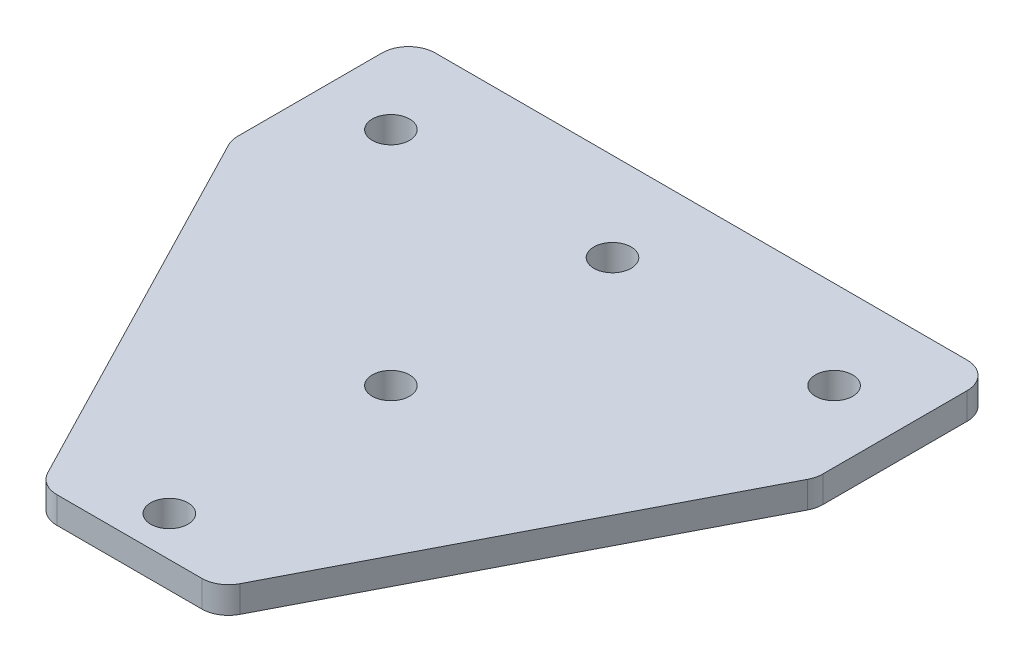
ISO-10303-21;
HEADER;
FILE_DESCRIPTION(('STEP AP214'),'2;1');
FILE_NAME('part.step','',(''),(''),'','','');
FILE_SCHEMA(('AUTOMOTIVE_DESIGN { 1 0 10303 214 1 1 1 1 }'));
ENDSEC;
DATA;
#1=APPLICATION_CONTEXT('core data for automotive mechanical design processes');
#2=APPLICATION_PROTOCOL_DEFINITION('international standard','automotive_design',2000,#1);
#3=PRODUCT_CONTEXT('',#1,'mechanical');
#4=PRODUCT('Part','Part','',(#3));
#5=PRODUCT_RELATED_PRODUCT_CATEGORY('part','',(#4));
#6=PRODUCT_DEFINITION_FORMATION('','',#4);
#7=PRODUCT_DEFINITION_CONTEXT('part definition',#1,'design');
#8=PRODUCT_DEFINITION('design','',#6,#7);
#9=PRODUCT_DEFINITION_SHAPE('','',#8);
#10=(LENGTH_UNIT() NAMED_UNIT(*) SI_UNIT(.MILLI.,.METRE.));
#11=(NAMED_UNIT(*) PLANE_ANGLE_UNIT() SI_UNIT($,.RADIAN.));
#12=(NAMED_UNIT(*) SI_UNIT($,.STERADIAN.) SOLID_ANGLE_UNIT());
#13=UNCERTAINTY_MEASURE_WITH_UNIT(LENGTH_MEASURE(1.E-05),#10,'distance_accuracy_value','');
#14=(GEOMETRIC_REPRESENTATION_CONTEXT(3) GLOBAL_UNCERTAINTY_ASSIGNED_CONTEXT((#13)) GLOBAL_UNIT_ASSIGNED_CONTEXT((#10,
#11,#12)) REPRESENTATION_CONTEXT('',''));
#15=CARTESIAN_POINT('',(0.,0.,0.));
#16=DIRECTION('',(0.,0.,1.));
#17=DIRECTION('',(1.,0.,0.));
#18=AXIS2_PLACEMENT_3D('',#15,#16,#17);
#19=CARTESIAN_POINT('',(30.121849158115,3.,15.5685961940819));
#20=DIRECTION('',(0.888358054995092,0.,0.459151354267126));
#21=DIRECTION('',(0.459151354267126,0.,-0.888358054995093));
#22=AXIS2_PLACEMENT_3D('',#19,#20,#21);
#23=PLANE('',#22);
#24=DIRECTION('',(-0.459151354267126,0.,0.888358054995093));
#25=VECTOR('',#24,1.);
#26=CARTESIAN_POINT('',(30.121849158115,3.,15.5685961940819));
#27=LINE('',#26,#25);
#28=CARTESIAN_POINT('',(32.6650741649853,3.,10.6480086807894));
#29=VERTEX_POINT('',#28);
#30=CARTESIAN_POINT('',(10.8386192484398,3.,52.8774540628014));
#31=VERTEX_POINT('',#30);
#32=EDGE_CURVE('E216',#29,#31,#27,.T.);
#33=ORIENTED_EDGE('',*,*,#32,.T.);
#34=DIRECTION('',(0.,-1.,0.));
#35=VECTOR('',#34,1.);
#36=CARTESIAN_POINT('',(10.8386192484398,0.,52.8774540628014));
#37=LINE('',#36,#35);
#38=CARTESIAN_POINT('',(10.8386192484398,0.,52.8774540628014));
#39=VERTEX_POINT('',#38);
#40=EDGE_CURVE('E151',#31,#39,#37,.T.);
#41=ORIENTED_EDGE('',*,*,#40,.T.);
#42=DIRECTION('',(-0.459151354267126,0.,0.888358054995093));
#43=VECTOR('',#42,1.);
#44=CARTESIAN_POINT('',(30.121849158115,0.,15.5685961940819));
#45=LINE('',#44,#43);
#46=CARTESIAN_POINT('',(32.6650741649853,0.,10.6480086807894));
#47=VERTEX_POINT('',#46);
#48=EDGE_CURVE('E136',#47,#39,#45,.T.);
#49=ORIENTED_EDGE('',*,*,#48,.F.);
#50=DIRECTION('',(0.,-1.,0.));
#51=VECTOR('',#50,1.);
#52=CARTESIAN_POINT('',(32.6650741649853,3.,10.6480086807894));
#53=LINE('',#52,#51);
#54=EDGE_CURVE('E148',#47,#29,#53,.F.);
#55=ORIENTED_EDGE('',*,*,#54,.T.);
#56=EDGE_LOOP('',(#33,#41,#49,#55));
#57=FACE_BOUND('',#56,.T.);
#58=ADVANCED_FACE('F41',(#57),#23,.T.);
#59=CARTESIAN_POINT('',(33.,3.,0.));
#60=DIRECTION('',(-1.,0.,0.));
#61=DIRECTION('',(0.,0.,1.));
#62=AXIS2_PLACEMENT_3D('',#59,#60,#61);
#63=PLANE('',#62);
#64=DIRECTION('',(0.,0.,-1.));
#65=VECTOR('',#64,1.);
#66=CARTESIAN_POINT('',(33.,3.,0.));
#67=LINE('',#66,#65);
#68=CARTESIAN_POINT('',(33.,3.,9.27055461798798));
#69=VERTEX_POINT('',#68);
#70=CARTESIAN_POINT('',(33.,3.,-7.));
#71=VERTEX_POINT('',#70);
#72=EDGE_CURVE('E207',#69,#71,#67,.T.);
#73=ORIENTED_EDGE('',*,*,#72,.F.);
#74=DIRECTION('',(0.,-1.,0.));
#75=VECTOR('',#74,1.);
#76=CARTESIAN_POINT('',(33.,0.,9.27055461798798));
#77=LINE('',#76,#75);
#78=CARTESIAN_POINT('',(33.,0.,9.27055461798798));
#79=VERTEX_POINT('',#78);
#80=EDGE_CURVE('E11',#69,#79,#77,.T.);
#81=ORIENTED_EDGE('',*,*,#80,.T.);
#82=DIRECTION('',(0.,0.,-1.));
#83=VECTOR('',#82,1.);
#84=CARTESIAN_POINT('',(33.,0.,0.));
#85=LINE('',#84,#83);
#86=CARTESIAN_POINT('',(33.,0.,-7.));
#87=VERTEX_POINT('',#86);
#88=EDGE_CURVE('E138',#79,#87,#85,.T.);
#89=ORIENTED_EDGE('',*,*,#88,.T.);
#90=DIRECTION('',(0.,-1.,0.));
#91=VECTOR('',#90,1.);
#92=CARTESIAN_POINT('',(33.,3.,-7.));
#93=LINE('',#92,#91);
#94=EDGE_CURVE('E49',#87,#71,#93,.F.);
#95=ORIENTED_EDGE('',*,*,#94,.T.);
#96=EDGE_LOOP('',(#73,#81,#89,#95));
#97=FACE_BOUND('',#96,.T.);
#98=ADVANCED_FACE('F206',(#97),#63,.F.);
#99=CARTESIAN_POINT('',(0.,3.,-10.));
#100=DIRECTION('',(0.,0.,1.));
#101=DIRECTION('',(1.,0.,0.));
#102=AXIS2_PLACEMENT_3D('',#99,#100,#101);
#103=PLANE('',#102);
#104=DIRECTION('',(-1.,0.,0.));
#105=VECTOR('',#104,1.);
#106=CARTESIAN_POINT('',(0.,0.,-10.));
#107=LINE('',#106,#105);
#108=CARTESIAN_POINT('',(30.,0.,-10.));
#109=VERTEX_POINT('',#108);
#110=CARTESIAN_POINT('',(-30.,0.,-10.));
#111=VERTEX_POINT('',#110);
#112=EDGE_CURVE('E223',#109,#111,#107,.T.);
#113=ORIENTED_EDGE('',*,*,#112,.T.);
#114=DIRECTION('',(0.,-1.,0.));
#115=VECTOR('',#114,1.);
#116=CARTESIAN_POINT('',(-30.,3.,-10.));
#117=LINE('',#116,#115);
#118=CARTESIAN_POINT('',(-30.,3.,-10.));
#119=VERTEX_POINT('',#118);
#120=EDGE_CURVE('E201',#111,#119,#117,.F.);
#121=ORIENTED_EDGE('',*,*,#120,.T.);
#122=DIRECTION('',(-1.,0.,0.));
#123=VECTOR('',#122,1.);
#124=CARTESIAN_POINT('',(0.,3.,-10.));
#125=LINE('',#124,#123);
#126=CARTESIAN_POINT('',(30.,3.,-10.));
#127=VERTEX_POINT('',#126);
#128=EDGE_CURVE('E215',#127,#119,#125,.T.);
#129=ORIENTED_EDGE('',*,*,#128,.F.);
#130=DIRECTION('',(0.,-1.,0.));
#131=VECTOR('',#130,1.);
#132=CARTESIAN_POINT('',(30.,3.,-10.));
#133=LINE('',#132,#131);
#134=EDGE_CURVE('E198',#127,#109,#133,.T.);
#135=ORIENTED_EDGE('',*,*,#134,.T.);
#136=EDGE_LOOP('',(#113,#121,#129,#135));
#137=FACE_BOUND('',#136,.T.);
#138=ADVANCED_FACE('F222',(#137),#103,.F.);
#139=CARTESIAN_POINT('',(-33.,3.,0.));
#140=DIRECTION('',(1.,0.,0.));
#141=DIRECTION('',(0.,0.,-1.));
#142=AXIS2_PLACEMENT_3D('',#139,#140,#141);
#143=PLANE('',#142);
#144=DIRECTION('',(0.,0.,1.));
#145=VECTOR('',#144,1.);
#146=CARTESIAN_POINT('',(-33.,0.,0.));
#147=LINE('',#146,#145);
#148=CARTESIAN_POINT('',(-33.,0.,-7.));
#149=VERTEX_POINT('',#148);
#150=CARTESIAN_POINT('',(-33.,0.,9.27055461798796));
#151=VERTEX_POINT('',#150);
#152=EDGE_CURVE('E226',#149,#151,#147,.T.);
#153=ORIENTED_EDGE('',*,*,#152,.T.);
#154=DIRECTION('',(0.,-1.,0.));
#155=VECTOR('',#154,1.);
#156=CARTESIAN_POINT('',(-33.,3.,9.27055461798796));
#157=LINE('',#156,#155);
#158=CARTESIAN_POINT('',(-33.,3.,9.27055461798796));
#159=VERTEX_POINT('',#158);
#160=EDGE_CURVE('E196',#151,#159,#157,.F.);
#161=ORIENTED_EDGE('',*,*,#160,.T.);
#162=DIRECTION('',(0.,0.,1.));
#163=VECTOR('',#162,1.);
#164=CARTESIAN_POINT('',(-33.,3.,0.));
#165=LINE('',#164,#163);
#166=CARTESIAN_POINT('',(-33.,3.,-7.));
#167=VERTEX_POINT('',#166);
#168=EDGE_CURVE('E255',#167,#159,#165,.T.);
#169=ORIENTED_EDGE('',*,*,#168,.F.);
#170=DIRECTION('',(0.,-1.,0.));
#171=VECTOR('',#170,1.);
#172=CARTESIAN_POINT('',(-33.,3.,-7.));
#173=LINE('',#172,#171);
#174=EDGE_CURVE('E193',#167,#149,#173,.T.);
#175=ORIENTED_EDGE('',*,*,#174,.T.);
#176=EDGE_LOOP('',(#153,#161,#169,#175));
#177=FACE_BOUND('',#176,.T.);
#178=ADVANCED_FACE('F368',(#177),#143,.F.);
#179=CARTESIAN_POINT('',(-30.121849158115,3.,15.5685961940819));
#180=DIRECTION('',(0.888358054995092,0.,-0.459151354267127));
#181=DIRECTION('',(-0.459151354267127,0.,-0.888358054995092));
#182=AXIS2_PLACEMENT_3D('',#179,#180,#181);
#183=PLANE('',#182);
#184=DIRECTION('',(0.459151354267127,0.,0.888358054995093));
#185=VECTOR('',#184,1.);
#186=CARTESIAN_POINT('',(-30.121849158115,0.,15.5685961940819));
#187=LINE('',#186,#185);
#188=CARTESIAN_POINT('',(-32.6650741649853,0.,10.6480086807893));
#189=VERTEX_POINT('',#188);
#190=CARTESIAN_POINT('',(-10.8386192484397,0.,52.8774540628014));
#191=VERTEX_POINT('',#190);
#192=EDGE_CURVE('E229',#189,#191,#187,.T.);
#193=ORIENTED_EDGE('',*,*,#192,.T.);
#194=DIRECTION('',(0.,-1.,0.));
#195=VECTOR('',#194,1.);
#196=CARTESIAN_POINT('',(-10.8386192484397,3.,52.8774540628014));
#197=LINE('',#196,#195);
#198=CARTESIAN_POINT('',(-10.8386192484397,3.,52.8774540628014));
#199=VERTEX_POINT('',#198);
#200=EDGE_CURVE('E56',#191,#199,#197,.F.);
#201=ORIENTED_EDGE('',*,*,#200,.T.);
#202=DIRECTION('',(0.459151354267127,0.,0.888358054995093));
#203=VECTOR('',#202,1.);
#204=CARTESIAN_POINT('',(-30.121849158115,3.,15.5685961940819));
#205=LINE('',#204,#203);
#206=CARTESIAN_POINT('',(-32.6650741649853,3.,10.6480086807893));
#207=VERTEX_POINT('',#206);
#208=EDGE_CURVE('E257',#207,#199,#205,.T.);
#209=ORIENTED_EDGE('',*,*,#208,.F.);
#210=DIRECTION('',(0.,-1.,0.));
#211=VECTOR('',#210,1.);
#212=CARTESIAN_POINT('',(-32.6650741649853,3.,10.6480086807893));
#213=LINE('',#212,#211);
#214=EDGE_CURVE('E189',#207,#189,#213,.T.);
#215=ORIENTED_EDGE('',*,*,#214,.T.);
#216=EDGE_LOOP('',(#193,#201,#209,#215));
#217=FACE_BOUND('',#216,.T.);
#218=ADVANCED_FACE('F364',(#217),#183,.F.);
#219=CARTESIAN_POINT('',(25.,3.,0.));
#220=DIRECTION('',(0.,-1.,0.));
#221=DIRECTION('',(0.,0.,-1.));
#222=AXIS2_PLACEMENT_3D('',#219,#220,#221);
#223=CYLINDRICAL_SURFACE('',#222,2.1);
#224=CARTESIAN_POINT('',(25.,3.,0.));
#225=DIRECTION('',(0.,1.,0.));
#226=DIRECTION('',(0.,0.,1.));
#227=AXIS2_PLACEMENT_3D('',#224,#225,#226);
#228=CIRCLE('',#227,2.1);
#229=CARTESIAN_POINT('',(25.,3.,2.1));
#230=VERTEX_POINT('',#229);
#231=EDGE_CURVE('E160',#230,#230,#228,.T.);
#232=ORIENTED_EDGE('',*,*,#231,.T.);
#233=EDGE_LOOP('',(#232));
#234=FACE_BOUND('',#233,.T.);
#235=CARTESIAN_POINT('',(25.,0.,0.));
#236=DIRECTION('',(0.,1.,0.));
#237=DIRECTION('',(0.,0.,1.));
#238=AXIS2_PLACEMENT_3D('',#235,#236,#237);
#239=CIRCLE('',#238,2.1);
#240=CARTESIAN_POINT('',(25.,0.,2.1));
#241=VERTEX_POINT('',#240);
#242=EDGE_CURVE('E245',#241,#241,#239,.T.);
#243=ORIENTED_EDGE('',*,*,#242,.F.);
#244=EDGE_LOOP('',(#243));
#245=FACE_BOUND('',#244,.T.);
#246=ADVANCED_FACE('F273',(#234,#245),#223,.F.);
#247=CARTESIAN_POINT('',(-25.,3.,0.));
#248=DIRECTION('',(0.,-1.,0.));
#249=DIRECTION('',(0.,0.,-1.));
#250=AXIS2_PLACEMENT_3D('',#247,#248,#249);
#251=CYLINDRICAL_SURFACE('',#250,2.1);
#252=CARTESIAN_POINT('',(-25.,3.,0.));
#253=DIRECTION('',(0.,1.,0.));
#254=DIRECTION('',(0.,0.,1.));
#255=AXIS2_PLACEMENT_3D('',#252,#253,#254);
#256=CIRCLE('',#255,2.1);
#257=CARTESIAN_POINT('',(-25.,3.,2.1));
#258=VERTEX_POINT('',#257);
#259=EDGE_CURVE('E267',#258,#258,#256,.T.);
#260=ORIENTED_EDGE('',*,*,#259,.T.);
#261=EDGE_LOOP('',(#260));
#262=FACE_BOUND('',#261,.T.);
#263=CARTESIAN_POINT('',(-25.,0.,0.));
#264=DIRECTION('',(0.,1.,0.));
#265=DIRECTION('',(0.,0.,1.));
#266=AXIS2_PLACEMENT_3D('',#263,#264,#265);
#267=CIRCLE('',#266,2.1);
#268=CARTESIAN_POINT('',(-25.,0.,2.1));
#269=VERTEX_POINT('',#268);
#270=EDGE_CURVE('E243',#269,#269,#267,.T.);
#271=ORIENTED_EDGE('',*,*,#270,.F.);
#272=EDGE_LOOP('',(#271));
#273=FACE_BOUND('',#272,.T.);
#274=ADVANCED_FACE('F396',(#262,#273),#251,.F.);
#275=CARTESIAN_POINT('',(0.,3.,25.));
#276=DIRECTION('',(0.,-1.,0.));
#277=DIRECTION('',(0.,0.,-1.));
#278=AXIS2_PLACEMENT_3D('',#275,#276,#277);
#279=CYLINDRICAL_SURFACE('',#278,2.1);
#280=CARTESIAN_POINT('',(0.,3.,25.));
#281=DIRECTION('',(0.,1.,0.));
#282=DIRECTION('',(0.,0.,1.));
#283=AXIS2_PLACEMENT_3D('',#280,#281,#282);
#284=CIRCLE('',#283,2.1);
#285=CARTESIAN_POINT('',(0.,3.,27.1));
#286=VERTEX_POINT('',#285);
#287=EDGE_CURVE('E264',#286,#286,#284,.T.);
#288=ORIENTED_EDGE('',*,*,#287,.T.);
#289=EDGE_LOOP('',(#288));
#290=FACE_BOUND('',#289,.T.);
#291=CARTESIAN_POINT('',(0.,0.,25.));
#292=DIRECTION('',(0.,1.,0.));
#293=DIRECTION('',(0.,0.,1.));
#294=AXIS2_PLACEMENT_3D('',#291,#292,#293);
#295=CIRCLE('',#294,2.1);
#296=CARTESIAN_POINT('',(0.,0.,27.1));
#297=VERTEX_POINT('',#296);
#298=EDGE_CURVE('E240',#297,#297,#295,.T.);
#299=ORIENTED_EDGE('',*,*,#298,.F.);
#300=EDGE_LOOP('',(#299));
#301=FACE_BOUND('',#300,.T.);
#302=ADVANCED_FACE('F392',(#290,#301),#279,.F.);
#303=CARTESIAN_POINT('',(0.,3.,50.));
#304=DIRECTION('',(0.,-1.,0.));
#305=DIRECTION('',(0.,0.,-1.));
#306=AXIS2_PLACEMENT_3D('',#303,#304,#305);
#307=CYLINDRICAL_SURFACE('',#306,2.1);
#308=CARTESIAN_POINT('',(0.,3.,50.));
#309=DIRECTION('',(0.,1.,0.));
#310=DIRECTION('',(0.,0.,1.));
#311=AXIS2_PLACEMENT_3D('',#308,#309,#310);
#312=CIRCLE('',#311,2.1);
#313=CARTESIAN_POINT('',(0.,3.,52.1));
#314=VERTEX_POINT('',#313);
#315=EDGE_CURVE('E261',#314,#314,#312,.T.);
#316=ORIENTED_EDGE('',*,*,#315,.T.);
#317=EDGE_LOOP('',(#316));
#318=FACE_BOUND('',#317,.T.);
#319=CARTESIAN_POINT('',(0.,0.,50.));
#320=DIRECTION('',(0.,1.,0.));
#321=DIRECTION('',(0.,0.,1.));
#322=AXIS2_PLACEMENT_3D('',#319,#320,#321);
#323=CIRCLE('',#322,2.1);
#324=CARTESIAN_POINT('',(0.,0.,52.1));
#325=VERTEX_POINT('',#324);
#326=EDGE_CURVE('E237',#325,#325,#323,.T.);
#327=ORIENTED_EDGE('',*,*,#326,.F.);
#328=EDGE_LOOP('',(#327));
#329=FACE_BOUND('',#328,.T.);
#330=ADVANCED_FACE('F291',(#318,#329),#307,.F.);
#331=CARTESIAN_POINT('',(0.,3.,54.5));
#332=DIRECTION('',(0.,0.,-1.));
#333=DIRECTION('',(-1.,0.,0.));
#334=AXIS2_PLACEMENT_3D('',#331,#332,#333);
#335=PLANE('',#334);
#336=DIRECTION('',(1.,0.,0.));
#337=VECTOR('',#336,1.);
#338=CARTESIAN_POINT('',(0.,0.,54.5));
#339=LINE('',#338,#337);
#340=CARTESIAN_POINT('',(-8.17354508345445,0.,54.5));
#341=VERTEX_POINT('',#340);
#342=CARTESIAN_POINT('',(8.17354508345447,0.,54.5));
#343=VERTEX_POINT('',#342);
#344=EDGE_CURVE('E234',#341,#343,#339,.T.);
#345=ORIENTED_EDGE('',*,*,#344,.T.);
#346=DIRECTION('',(0.,-1.,0.));
#347=VECTOR('',#346,1.);
#348=CARTESIAN_POINT('',(8.17354508345447,3.,54.5));
#349=LINE('',#348,#347);
#350=CARTESIAN_POINT('',(8.17354508345447,3.,54.5));
#351=VERTEX_POINT('',#350);
#352=EDGE_CURVE('E177',#343,#351,#349,.F.);
#353=ORIENTED_EDGE('',*,*,#352,.T.);
#354=DIRECTION('',(1.,0.,0.));
#355=VECTOR('',#354,1.);
#356=CARTESIAN_POINT('',(0.,3.,54.5));
#357=LINE('',#356,#355);
#358=CARTESIAN_POINT('',(-8.17354508345445,3.,54.5));
#359=VERTEX_POINT('',#358);
#360=EDGE_CURVE('E259',#359,#351,#357,.T.);
#361=ORIENTED_EDGE('',*,*,#360,.F.);
#362=DIRECTION('',(0.,-1.,0.));
#363=VECTOR('',#362,1.);
#364=CARTESIAN_POINT('',(-8.17354508345445,3.,54.5));
#365=LINE('',#364,#363);
#366=EDGE_CURVE('E174',#359,#341,#365,.T.);
#367=ORIENTED_EDGE('',*,*,#366,.T.);
#368=EDGE_LOOP('',(#345,#353,#361,#367));
#369=FACE_BOUND('',#368,.T.);
#370=ADVANCED_FACE('F284',(#369),#335,.F.);
#371=CARTESIAN_POINT('',(0.,3.,0.));
#372=DIRECTION('',(0.,-1.,0.));
#373=DIRECTION('',(0.,0.,-1.));
#374=AXIS2_PLACEMENT_3D('',#371,#372,#373);
#375=CYLINDRICAL_SURFACE('',#374,2.1);
#376=CARTESIAN_POINT('',(0.,3.,0.));
#377=DIRECTION('',(0.,1.,0.));
#378=DIRECTION('',(0.,0.,1.));
#379=AXIS2_PLACEMENT_3D('',#376,#377,#378);
#380=CIRCLE('',#379,2.1);
#381=CARTESIAN_POINT('',(0.,3.,2.1));
#382=VERTEX_POINT('',#381);
#383=EDGE_CURVE('E156',#382,#382,#380,.T.);
#384=ORIENTED_EDGE('',*,*,#383,.T.);
#385=EDGE_LOOP('',(#384));
#386=FACE_BOUND('',#385,.T.);
#387=CARTESIAN_POINT('',(0.,0.,0.));
#388=DIRECTION('',(0.,1.,0.));
#389=DIRECTION('',(0.,0.,1.));
#390=AXIS2_PLACEMENT_3D('',#387,#388,#389);
#391=CIRCLE('',#390,2.1);
#392=CARTESIAN_POINT('',(0.,0.,2.1));
#393=VERTEX_POINT('',#392);
#394=EDGE_CURVE('E163',#393,#393,#391,.T.);
#395=ORIENTED_EDGE('',*,*,#394,.F.);
#396=EDGE_LOOP('',(#395));
#397=FACE_BOUND('',#396,.T.);
#398=ADVANCED_FACE('F278',(#386,#397),#375,.F.);
#399=CARTESIAN_POINT('',(0.,3.,0.));
#400=DIRECTION('',(0.,1.,0.));
#401=DIRECTION('',(0.,0.,1.));
#402=AXIS2_PLACEMENT_3D('',#399,#400,#401);
#403=PLANE('',#402);
#404=ORIENTED_EDGE('',*,*,#360,.T.);
#405=CARTESIAN_POINT('',(8.17354508345447,3.,51.5));
#406=DIRECTION('',(0.,1.,0.));
#407=DIRECTION('',(0.,0.,1.));
#408=AXIS2_PLACEMENT_3D('',#405,#406,#407);
#409=CIRCLE('',#408,3.);
#410=EDGE_CURVE('E187',#351,#31,#409,.T.);
#411=ORIENTED_EDGE('',*,*,#410,.T.);
#412=ORIENTED_EDGE('',*,*,#32,.F.);
#413=CARTESIAN_POINT('',(30.,3.,9.27055461798798));
#414=DIRECTION('',(0.,1.,0.));
#415=DIRECTION('',(0.,0.,1.));
#416=AXIS2_PLACEMENT_3D('',#413,#414,#415);
#417=CIRCLE('',#416,3.);
#418=EDGE_CURVE('E155',#29,#69,#417,.T.);
#419=ORIENTED_EDGE('',*,*,#418,.T.);
#420=ORIENTED_EDGE('',*,*,#72,.T.);
#421=CARTESIAN_POINT('',(30.,3.,-7.));
#422=DIRECTION('',(0.,1.,0.));
#423=DIRECTION('',(0.,0.,1.));
#424=AXIS2_PLACEMENT_3D('',#421,#422,#423);
#425=CIRCLE('',#424,3.);
#426=EDGE_CURVE('E179',#71,#127,#425,.T.);
#427=ORIENTED_EDGE('',*,*,#426,.T.);
#428=ORIENTED_EDGE('',*,*,#128,.T.);
#429=CARTESIAN_POINT('',(-30.,3.,-7.));
#430=DIRECTION('',(0.,1.,0.));
#431=DIRECTION('',(0.,0.,1.));
#432=AXIS2_PLACEMENT_3D('',#429,#430,#431);
#433=CIRCLE('',#432,3.);
#434=EDGE_CURVE('E182',#119,#167,#433,.T.);
#435=ORIENTED_EDGE('',*,*,#434,.T.);
#436=ORIENTED_EDGE('',*,*,#168,.T.);
#437=CARTESIAN_POINT('',(-30.,3.,9.27055461798796));
#438=DIRECTION('',(0.,1.,0.));
#439=DIRECTION('',(0.,0.,1.));
#440=AXIS2_PLACEMENT_3D('',#437,#438,#439);
#441=CIRCLE('',#440,3.);
#442=EDGE_CURVE('E63',#159,#207,#441,.T.);
#443=ORIENTED_EDGE('',*,*,#442,.T.);
#444=ORIENTED_EDGE('',*,*,#208,.T.);
#445=CARTESIAN_POINT('',(-8.17354508345445,3.,51.5));
#446=DIRECTION('',(0.,1.,0.));
#447=DIRECTION('',(0.,0.,1.));
#448=AXIS2_PLACEMENT_3D('',#445,#446,#447);
#449=CIRCLE('',#448,3.);
#450=EDGE_CURVE('E185',#199,#359,#449,.T.);
#451=ORIENTED_EDGE('',*,*,#450,.T.);
#452=EDGE_LOOP('',(#404,#411,#412,#419,#420,#427,#428,#435,#436,#443,#444,#451));
#453=FACE_BOUND('',#452,.T.);
#454=ORIENTED_EDGE('',*,*,#315,.F.);
#455=EDGE_LOOP('',(#454));
#456=FACE_BOUND('',#455,.T.);
#457=ORIENTED_EDGE('',*,*,#287,.F.);
#458=EDGE_LOOP('',(#457));
#459=FACE_BOUND('',#458,.T.);
#460=ORIENTED_EDGE('',*,*,#259,.F.);
#461=EDGE_LOOP('',(#460));
#462=FACE_BOUND('',#461,.T.);
#463=ORIENTED_EDGE('',*,*,#231,.F.);
#464=EDGE_LOOP('',(#463));
#465=FACE_BOUND('',#464,.T.);
#466=ORIENTED_EDGE('',*,*,#383,.F.);
#467=EDGE_LOOP('',(#466));
#468=FACE_BOUND('',#467,.T.);
#469=ADVANCED_FACE('F211',(#453,#456,#459,#462,#465,#468),#403,.T.);
#470=CARTESIAN_POINT('',(0.,0.,0.));
#471=DIRECTION('',(0.,1.,0.));
#472=DIRECTION('',(0.,0.,1.));
#473=AXIS2_PLACEMENT_3D('',#470,#471,#472);
#474=PLANE('',#473);
#475=ORIENTED_EDGE('',*,*,#48,.T.);
#476=CARTESIAN_POINT('',(8.17354508345447,0.,51.5));
#477=DIRECTION('',(0.,1.,0.));
#478=DIRECTION('',(0.,0.,1.));
#479=AXIS2_PLACEMENT_3D('',#476,#477,#478);
#480=CIRCLE('',#479,3.);
#481=EDGE_CURVE('E172',#39,#343,#480,.F.);
#482=ORIENTED_EDGE('',*,*,#481,.T.);
#483=ORIENTED_EDGE('',*,*,#344,.F.);
#484=CARTESIAN_POINT('',(-8.17354508345445,0.,51.5));
#485=DIRECTION('',(0.,1.,0.));
#486=DIRECTION('',(0.,0.,1.));
#487=AXIS2_PLACEMENT_3D('',#484,#485,#486);
#488=CIRCLE('',#487,3.);
#489=EDGE_CURVE('E170',#341,#191,#488,.F.);
#490=ORIENTED_EDGE('',*,*,#489,.T.);
#491=ORIENTED_EDGE('',*,*,#192,.F.);
#492=CARTESIAN_POINT('',(-30.,0.,9.27055461798796));
#493=DIRECTION('',(0.,1.,0.));
#494=DIRECTION('',(0.,0.,1.));
#495=AXIS2_PLACEMENT_3D('',#492,#493,#494);
#496=CIRCLE('',#495,3.);
#497=EDGE_CURVE('E168',#189,#151,#496,.F.);
#498=ORIENTED_EDGE('',*,*,#497,.T.);
#499=ORIENTED_EDGE('',*,*,#152,.F.);
#500=CARTESIAN_POINT('',(-30.,0.,-7.));
#501=DIRECTION('',(0.,1.,0.));
#502=DIRECTION('',(0.,0.,1.));
#503=AXIS2_PLACEMENT_3D('',#500,#501,#502);
#504=CIRCLE('',#503,3.);
#505=EDGE_CURVE('E142',#149,#111,#504,.F.);
#506=ORIENTED_EDGE('',*,*,#505,.T.);
#507=ORIENTED_EDGE('',*,*,#112,.F.);
#508=CARTESIAN_POINT('',(30.,0.,-7.));
#509=DIRECTION('',(0.,1.,0.));
#510=DIRECTION('',(0.,0.,1.));
#511=AXIS2_PLACEMENT_3D('',#508,#509,#510);
#512=CIRCLE('',#511,3.);
#513=EDGE_CURVE('E143',#109,#87,#512,.F.);
#514=ORIENTED_EDGE('',*,*,#513,.T.);
#515=ORIENTED_EDGE('',*,*,#88,.F.);
#516=CARTESIAN_POINT('',(30.,0.,9.27055461798798));
#517=DIRECTION('',(0.,1.,0.));
#518=DIRECTION('',(0.,0.,1.));
#519=AXIS2_PLACEMENT_3D('',#516,#517,#518);
#520=CIRCLE('',#519,3.);
#521=EDGE_CURVE('E132',#79,#47,#520,.F.);
#522=ORIENTED_EDGE('',*,*,#521,.T.);
#523=EDGE_LOOP('',(#475,#482,#483,#490,#491,#498,#499,#506,#507,#514,#515,#522));
#524=FACE_BOUND('',#523,.T.);
#525=ORIENTED_EDGE('',*,*,#326,.T.);
#526=EDGE_LOOP('',(#525));
#527=FACE_BOUND('',#526,.T.);
#528=ORIENTED_EDGE('',*,*,#298,.T.);
#529=EDGE_LOOP('',(#528));
#530=FACE_BOUND('',#529,.T.);
#531=ORIENTED_EDGE('',*,*,#270,.T.);
#532=EDGE_LOOP('',(#531));
#533=FACE_BOUND('',#532,.T.);
#534=ORIENTED_EDGE('',*,*,#242,.T.);
#535=EDGE_LOOP('',(#534));
#536=FACE_BOUND('',#535,.T.);
#537=ORIENTED_EDGE('',*,*,#394,.T.);
#538=EDGE_LOOP('',(#537));
#539=FACE_BOUND('',#538,.T.);
#540=ADVANCED_FACE('F134',(#524,#527,#530,#533,#536,#539),#474,.F.);
#541=CARTESIAN_POINT('',(8.17354508345447,3.,51.5));
#542=DIRECTION('',(0.,1.,0.));
#543=DIRECTION('',(0.,0.,1.));
#544=AXIS2_PLACEMENT_3D('',#541,#542,#543);
#545=CYLINDRICAL_SURFACE('',#544,3.);
#546=ORIENTED_EDGE('',*,*,#410,.F.);
#547=ORIENTED_EDGE('',*,*,#352,.F.);
#548=ORIENTED_EDGE('',*,*,#481,.F.);
#549=ORIENTED_EDGE('',*,*,#40,.F.);
#550=EDGE_LOOP('',(#546,#547,#548,#549));
#551=FACE_BOUND('',#550,.T.);
#552=ADVANCED_FACE('F303',(#551),#545,.T.);
#553=CARTESIAN_POINT('',(-8.17354508345445,3.,51.5));
#554=DIRECTION('',(0.,-1.,0.));
#555=DIRECTION('',(0.,0.,-1.));
#556=AXIS2_PLACEMENT_3D('',#553,#554,#555);
#557=CYLINDRICAL_SURFACE('',#556,3.);
#558=ORIENTED_EDGE('',*,*,#450,.F.);
#559=ORIENTED_EDGE('',*,*,#200,.F.);
#560=ORIENTED_EDGE('',*,*,#489,.F.);
#561=ORIENTED_EDGE('',*,*,#366,.F.);
#562=EDGE_LOOP('',(#558,#559,#560,#561));
#563=FACE_BOUND('',#562,.T.);
#564=ADVANCED_FACE('F306',(#563),#557,.T.);
#565=CARTESIAN_POINT('',(-30.,3.,9.27055461798796));
#566=DIRECTION('',(0.,-1.,0.));
#567=DIRECTION('',(0.,0.,-1.));
#568=AXIS2_PLACEMENT_3D('',#565,#566,#567);
#569=CYLINDRICAL_SURFACE('',#568,3.);
#570=ORIENTED_EDGE('',*,*,#442,.F.);
#571=ORIENTED_EDGE('',*,*,#160,.F.);
#572=ORIENTED_EDGE('',*,*,#497,.F.);
#573=ORIENTED_EDGE('',*,*,#214,.F.);
#574=EDGE_LOOP('',(#570,#571,#572,#573));
#575=FACE_BOUND('',#574,.T.);
#576=ADVANCED_FACE('F310',(#575),#569,.T.);
#577=CARTESIAN_POINT('',(-30.,3.,-7.));
#578=DIRECTION('',(0.,-1.,0.));
#579=DIRECTION('',(0.,0.,-1.));
#580=AXIS2_PLACEMENT_3D('',#577,#578,#579);
#581=CYLINDRICAL_SURFACE('',#580,3.);
#582=ORIENTED_EDGE('',*,*,#434,.F.);
#583=ORIENTED_EDGE('',*,*,#120,.F.);
#584=ORIENTED_EDGE('',*,*,#505,.F.);
#585=ORIENTED_EDGE('',*,*,#174,.F.);
#586=EDGE_LOOP('',(#582,#583,#584,#585));
#587=FACE_BOUND('',#586,.T.);
#588=ADVANCED_FACE('F314',(#587),#581,.T.);
#589=CARTESIAN_POINT('',(30.,3.,9.27055461798798));
#590=DIRECTION('',(0.,1.,0.));
#591=DIRECTION('',(0.,0.,1.));
#592=AXIS2_PLACEMENT_3D('',#589,#590,#591);
#593=CYLINDRICAL_SURFACE('',#592,3.);
#594=ORIENTED_EDGE('',*,*,#418,.F.);
#595=ORIENTED_EDGE('',*,*,#54,.F.);
#596=ORIENTED_EDGE('',*,*,#521,.F.);
#597=ORIENTED_EDGE('',*,*,#80,.F.);
#598=EDGE_LOOP('',(#594,#595,#596,#597));
#599=FACE_BOUND('',#598,.T.);
#600=ADVANCED_FACE('F154',(#599),#593,.T.);
#601=CARTESIAN_POINT('',(30.,3.,-7.));
#602=DIRECTION('',(0.,-1.,0.));
#603=DIRECTION('',(0.,0.,-1.));
#604=AXIS2_PLACEMENT_3D('',#601,#602,#603);
#605=CYLINDRICAL_SURFACE('',#604,3.);
#606=ORIENTED_EDGE('',*,*,#426,.F.);
#607=ORIENTED_EDGE('',*,*,#94,.F.);
#608=ORIENTED_EDGE('',*,*,#513,.F.);
#609=ORIENTED_EDGE('',*,*,#134,.F.);
#610=EDGE_LOOP('',(#606,#607,#608,#609));
#611=FACE_BOUND('',#610,.T.);
#612=ADVANCED_FACE('F43',(#611),#605,.T.);
#613=CLOSED_SHELL('',(#58,#98,#138,#178,#218,#246,#274,#302,#330,#370,#398,#469,#540,#552,#564,
#576,#588,#600,#612));
#614=MANIFOLD_SOLID_BREP('B2',#613);
#615=ADVANCED_BREP_SHAPE_REPRESENTATION('',(#18,#614),#14);
#616=SHAPE_DEFINITION_REPRESENTATION(#9,#615);
ENDSEC;
END-ISO-10303-21;
